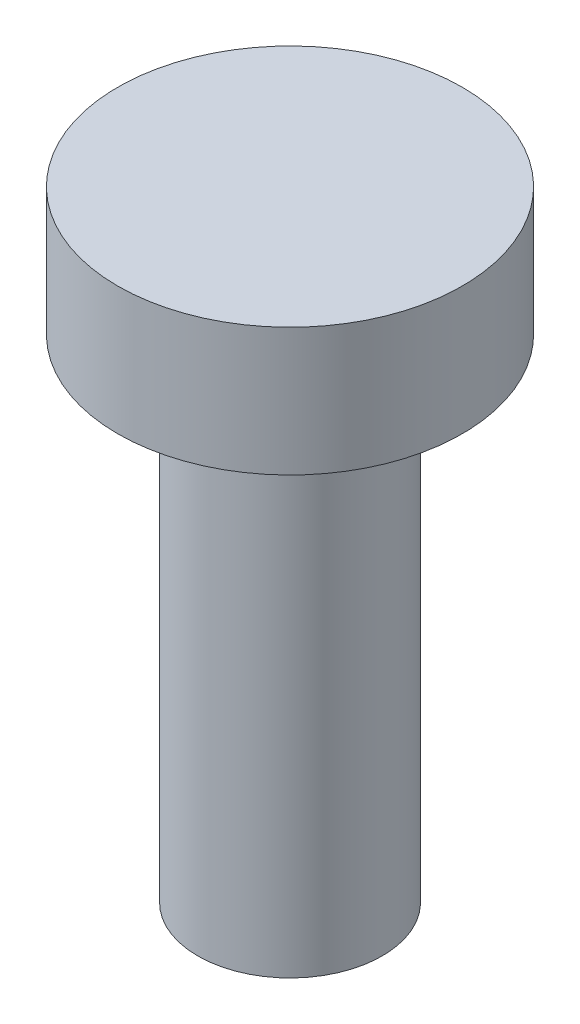
ISO-10303-21;
HEADER;
FILE_DESCRIPTION(('STEP AP214'),'2;1');
FILE_NAME('part.step','',(''),(''),'','','');
FILE_SCHEMA(('AUTOMOTIVE_DESIGN { 1 0 10303 214 1 1 1 1 }'));
ENDSEC;
DATA;
#1=APPLICATION_CONTEXT('core data for automotive mechanical design processes');
#2=APPLICATION_PROTOCOL_DEFINITION('international standard','automotive_design',2000,#1);
#3=PRODUCT_CONTEXT('',#1,'mechanical');
#4=PRODUCT('Part','Part','',(#3));
#5=PRODUCT_RELATED_PRODUCT_CATEGORY('part','',(#4));
#6=PRODUCT_DEFINITION_FORMATION('','',#4);
#7=PRODUCT_DEFINITION_CONTEXT('part definition',#1,'design');
#8=PRODUCT_DEFINITION('design','',#6,#7);
#9=PRODUCT_DEFINITION_SHAPE('','',#8);
#10=(LENGTH_UNIT() NAMED_UNIT(*) SI_UNIT(.MILLI.,.METRE.));
#11=(NAMED_UNIT(*) PLANE_ANGLE_UNIT() SI_UNIT($,.RADIAN.));
#12=(NAMED_UNIT(*) SI_UNIT($,.STERADIAN.) SOLID_ANGLE_UNIT());
#13=UNCERTAINTY_MEASURE_WITH_UNIT(LENGTH_MEASURE(1.E-05),#10,'distance_accuracy_value','');
#14=(GEOMETRIC_REPRESENTATION_CONTEXT(3) GLOBAL_UNCERTAINTY_ASSIGNED_CONTEXT((#13)) GLOBAL_UNIT_ASSIGNED_CONTEXT((#10,
#11,#12)) REPRESENTATION_CONTEXT('',''));
#15=CARTESIAN_POINT('',(0.,0.,0.));
#16=DIRECTION('',(0.,0.,1.));
#17=DIRECTION('',(1.,0.,0.));
#18=AXIS2_PLACEMENT_3D('',#15,#16,#17);
#19=CARTESIAN_POINT('',(0.,12.7,0.));
#20=DIRECTION('',(0.,1.,0.));
#21=DIRECTION('',(0.,0.,1.));
#22=AXIS2_PLACEMENT_3D('',#19,#20,#21);
#23=CYLINDRICAL_SURFACE('',#22,2.38125);
#24=CARTESIAN_POINT('',(0.,12.7,0.));
#25=DIRECTION('',(0.,1.,0.));
#26=DIRECTION('',(0.,0.,1.));
#27=AXIS2_PLACEMENT_3D('',#24,#25,#26);
#28=CIRCLE('',#27,2.38125);
#29=CARTESIAN_POINT('',(0.,12.7,2.38125));
#30=VERTEX_POINT('',#29);
#31=EDGE_CURVE('E10',#30,#30,#28,.T.);
#32=ORIENTED_EDGE('',*,*,#31,.F.);
#33=EDGE_LOOP('',(#32));
#34=FACE_BOUND('',#33,.T.);
#35=CARTESIAN_POINT('',(0.,0.,0.));
#36=DIRECTION('',(0.,1.,0.));
#37=DIRECTION('',(0.,0.,1.));
#38=AXIS2_PLACEMENT_3D('',#35,#36,#37);
#39=CIRCLE('',#38,2.38125);
#40=CARTESIAN_POINT('',(0.,0.,2.38125));
#41=VERTEX_POINT('',#40);
#42=EDGE_CURVE('E49',#41,#41,#39,.T.);
#43=ORIENTED_EDGE('',*,*,#42,.T.);
#44=EDGE_LOOP('',(#43));
#45=FACE_BOUND('',#44,.T.);
#46=ADVANCED_FACE('F35',(#34,#45),#23,.T.);
#47=CARTESIAN_POINT('',(2.38125,12.7,0.));
#48=DIRECTION('',(0.,1.,0.));
#49=DIRECTION('',(0.,0.,1.));
#50=AXIS2_PLACEMENT_3D('',#47,#48,#49);
#51=PLANE('',#50);
#52=CARTESIAN_POINT('',(0.,12.7,0.));
#53=DIRECTION('',(0.,1.,0.));
#54=DIRECTION('',(0.,0.,1.));
#55=AXIS2_PLACEMENT_3D('',#52,#53,#54);
#56=CIRCLE('',#55,4.445);
#57=CARTESIAN_POINT('',(0.,12.7,4.445));
#58=VERTEX_POINT('',#57);
#59=EDGE_CURVE('E41',#58,#58,#56,.T.);
#60=ORIENTED_EDGE('',*,*,#59,.F.);
#61=EDGE_LOOP('',(#60));
#62=FACE_BOUND('',#61,.T.);
#63=ORIENTED_EDGE('',*,*,#31,.T.);
#64=EDGE_LOOP('',(#63));
#65=FACE_BOUND('',#64,.T.);
#66=ADVANCED_FACE('F67',(#62,#65),#51,.F.);
#67=CARTESIAN_POINT('',(0.,12.7,0.));
#68=DIRECTION('',(0.,1.,0.));
#69=DIRECTION('',(0.,0.,1.));
#70=AXIS2_PLACEMENT_3D('',#67,#68,#69);
#71=CYLINDRICAL_SURFACE('',#70,4.445);
#72=CARTESIAN_POINT('',(0.,16.002,0.));
#73=DIRECTION('',(0.,1.,0.));
#74=DIRECTION('',(0.,0.,1.));
#75=AXIS2_PLACEMENT_3D('',#72,#73,#74);
#76=CIRCLE('',#75,4.445);
#77=CARTESIAN_POINT('',(0.,16.002,4.445));
#78=VERTEX_POINT('',#77);
#79=EDGE_CURVE('E45',#78,#78,#76,.T.);
#80=ORIENTED_EDGE('',*,*,#79,.F.);
#81=EDGE_LOOP('',(#80));
#82=FACE_BOUND('',#81,.T.);
#83=ORIENTED_EDGE('',*,*,#59,.T.);
#84=EDGE_LOOP('',(#83));
#85=FACE_BOUND('',#84,.T.);
#86=ADVANCED_FACE('F63',(#82,#85),#71,.T.);
#87=CARTESIAN_POINT('',(4.445,16.002,0.));
#88=DIRECTION('',(0.,-1.,0.));
#89=DIRECTION('',(0.,0.,-1.));
#90=AXIS2_PLACEMENT_3D('',#87,#88,#89);
#91=PLANE('',#90);
#92=ORIENTED_EDGE('',*,*,#79,.T.);
#93=EDGE_LOOP('',(#92));
#94=FACE_BOUND('',#93,.T.);
#95=ADVANCED_FACE('F58',(#94),#91,.F.);
#96=CARTESIAN_POINT('',(0.,0.,0.));
#97=DIRECTION('',(0.,1.,0.));
#98=DIRECTION('',(0.,0.,1.));
#99=AXIS2_PLACEMENT_3D('',#96,#97,#98);
#100=PLANE('',#99);
#101=ORIENTED_EDGE('',*,*,#42,.F.);
#102=EDGE_LOOP('',(#101));
#103=FACE_BOUND('',#102,.T.);
#104=ADVANCED_FACE('F56',(#103),#100,.F.);
#105=CLOSED_SHELL('',(#46,#66,#86,#95,#104));
#106=MANIFOLD_SOLID_BREP('B2',#105);
#107=ADVANCED_BREP_SHAPE_REPRESENTATION('',(#18,#106),#14);
#108=SHAPE_DEFINITION_REPRESENTATION(#9,#107);
ENDSEC;
END-ISO-10303-21;
